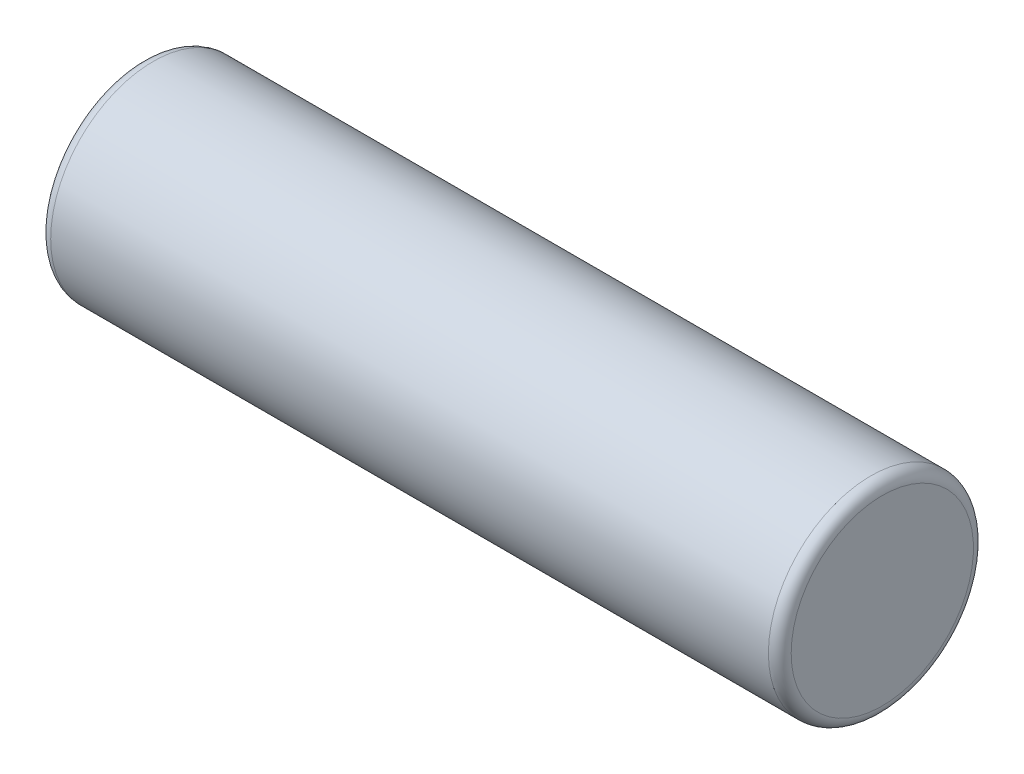
ISO-10303-21;
HEADER;
FILE_DESCRIPTION(('STEP AP214'),'2;1');
FILE_NAME('part.step','',(''),(''),'','','');
FILE_SCHEMA(('AUTOMOTIVE_DESIGN { 1 0 10303 214 1 1 1 1 }'));
ENDSEC;
DATA;
#1=APPLICATION_CONTEXT('core data for automotive mechanical design processes');
#2=APPLICATION_PROTOCOL_DEFINITION('international standard','automotive_design',2000,#1);
#3=PRODUCT_CONTEXT('',#1,'mechanical');
#4=PRODUCT('Part','Part','',(#3));
#5=PRODUCT_RELATED_PRODUCT_CATEGORY('part','',(#4));
#6=PRODUCT_DEFINITION_FORMATION('','',#4);
#7=PRODUCT_DEFINITION_CONTEXT('part definition',#1,'design');
#8=PRODUCT_DEFINITION('design','',#6,#7);
#9=PRODUCT_DEFINITION_SHAPE('','',#8);
#10=(LENGTH_UNIT() NAMED_UNIT(*) SI_UNIT(.MILLI.,.METRE.));
#11=(NAMED_UNIT(*) PLANE_ANGLE_UNIT() SI_UNIT($,.RADIAN.));
#12=(NAMED_UNIT(*) SI_UNIT($,.STERADIAN.) SOLID_ANGLE_UNIT());
#13=UNCERTAINTY_MEASURE_WITH_UNIT(LENGTH_MEASURE(1.E-05),#10,'distance_accuracy_value','');
#14=(GEOMETRIC_REPRESENTATION_CONTEXT(3) GLOBAL_UNCERTAINTY_ASSIGNED_CONTEXT((#13)) GLOBAL_UNIT_ASSIGNED_CONTEXT((#10,
#11,#12)) REPRESENTATION_CONTEXT('',''));
#15=CARTESIAN_POINT('',(0.,0.,0.));
#16=DIRECTION('',(0.,0.,1.));
#17=DIRECTION('',(1.,0.,0.));
#18=AXIS2_PLACEMENT_3D('',#15,#16,#17);
#19=CARTESIAN_POINT('',(32.5,0.,4.5));
#20=DIRECTION('',(-1.,0.,0.));
#21=DIRECTION('',(0.,0.,1.));
#22=AXIS2_PLACEMENT_3D('',#19,#20,#21);
#23=PLANE('',#22);
#24=CARTESIAN_POINT('',(32.5,0.,4.5));
#25=DIRECTION('',(-1.,0.,0.));
#26=DIRECTION('',(0.,0.,1.));
#27=AXIS2_PLACEMENT_3D('',#24,#25,#26);
#28=CIRCLE('',#27,8.);
#29=CARTESIAN_POINT('',(32.5,0.,12.5));
#30=VERTEX_POINT('',#29);
#31=EDGE_CURVE('E38',#30,#30,#28,.F.);
#32=ORIENTED_EDGE('',*,*,#31,.T.);
#33=EDGE_LOOP('',(#32));
#34=FACE_BOUND('',#33,.T.);
#35=ADVANCED_FACE('F31',(#34),#23,.F.);
#36=CARTESIAN_POINT('',(-32.5,0.,4.5));
#37=DIRECTION('',(1.,0.,0.));
#38=DIRECTION('',(0.,0.,-1.));
#39=AXIS2_PLACEMENT_3D('',#36,#37,#38);
#40=PLANE('',#39);
#41=CARTESIAN_POINT('',(-32.5,0.,4.5));
#42=DIRECTION('',(1.,0.,0.));
#43=DIRECTION('',(0.,0.,-1.));
#44=AXIS2_PLACEMENT_3D('',#41,#42,#43);
#45=CIRCLE('',#44,8.);
#46=CARTESIAN_POINT('',(-32.5,0.,-3.5));
#47=VERTEX_POINT('',#46);
#48=EDGE_CURVE('E10',#47,#47,#45,.F.);
#49=ORIENTED_EDGE('',*,*,#48,.T.);
#50=EDGE_LOOP('',(#49));
#51=FACE_BOUND('',#50,.T.);
#52=ADVANCED_FACE('F62',(#51),#40,.F.);
#53=CARTESIAN_POINT('',(-32.5,0.,4.5));
#54=DIRECTION('',(-1.,0.,0.));
#55=DIRECTION('',(0.,0.,1.));
#56=AXIS2_PLACEMENT_3D('',#53,#54,#55);
#57=CYLINDRICAL_SURFACE('',#56,9.);
#58=CARTESIAN_POINT('',(31.5,0.,4.5));
#59=DIRECTION('',(-1.,0.,0.));
#60=DIRECTION('',(0.,0.,1.));
#61=AXIS2_PLACEMENT_3D('',#58,#59,#60);
#62=CIRCLE('',#61,9.);
#63=CARTESIAN_POINT('',(31.5,0.,13.5));
#64=VERTEX_POINT('',#63);
#65=EDGE_CURVE('E42',#64,#64,#62,.T.);
#66=ORIENTED_EDGE('',*,*,#65,.T.);
#67=EDGE_LOOP('',(#66));
#68=FACE_BOUND('',#67,.T.);
#69=CARTESIAN_POINT('',(-31.5,0.,4.5));
#70=DIRECTION('',(1.,0.,0.));
#71=DIRECTION('',(0.,0.,-1.));
#72=AXIS2_PLACEMENT_3D('',#69,#70,#71);
#73=CIRCLE('',#72,9.);
#74=CARTESIAN_POINT('',(-31.5,0.,-4.5));
#75=VERTEX_POINT('',#74);
#76=EDGE_CURVE('E46',#75,#75,#73,.T.);
#77=ORIENTED_EDGE('',*,*,#76,.T.);
#78=EDGE_LOOP('',(#77));
#79=FACE_BOUND('',#78,.T.);
#80=ADVANCED_FACE('F52',(#68,#79),#57,.T.);
#81=CARTESIAN_POINT('',(31.5,0.,4.5));
#82=DIRECTION('',(-1.,0.,0.));
#83=DIRECTION('',(0.,0.,1.));
#84=AXIS2_PLACEMENT_3D('',#81,#82,#83);
#85=TOROIDAL_SURFACE('',#84,8.,1.);
#86=ORIENTED_EDGE('',*,*,#31,.F.);
#87=EDGE_LOOP('',(#86));
#88=FACE_BOUND('',#87,.T.);
#89=ORIENTED_EDGE('',*,*,#65,.F.);
#90=EDGE_LOOP('',(#89));
#91=FACE_BOUND('',#90,.T.);
#92=ADVANCED_FACE('F56',(#88,#91),#85,.T.);
#93=CARTESIAN_POINT('',(-31.5,0.,4.5));
#94=DIRECTION('',(1.,0.,0.));
#95=DIRECTION('',(0.,0.,-1.));
#96=AXIS2_PLACEMENT_3D('',#93,#94,#95);
#97=TOROIDAL_SURFACE('',#96,8.,1.);
#98=ORIENTED_EDGE('',*,*,#76,.F.);
#99=EDGE_LOOP('',(#98));
#100=FACE_BOUND('',#99,.T.);
#101=ORIENTED_EDGE('',*,*,#48,.F.);
#102=EDGE_LOOP('',(#101));
#103=FACE_BOUND('',#102,.T.);
#104=ADVANCED_FACE('F33',(#100,#103),#97,.T.);
#105=CLOSED_SHELL('',(#35,#52,#80,#92,#104));
#106=MANIFOLD_SOLID_BREP('B2',#105);
#107=ADVANCED_BREP_SHAPE_REPRESENTATION('',(#18,#106),#14);
#108=SHAPE_DEFINITION_REPRESENTATION(#9,#107);
ENDSEC;
END-ISO-10303-21;
